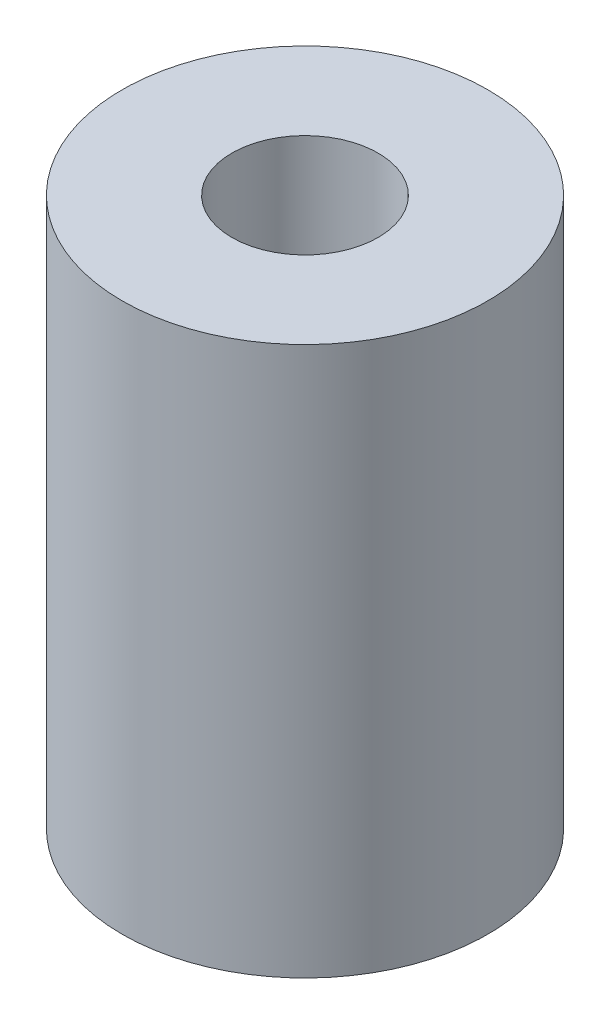
ISO-10303-21;
HEADER;
FILE_DESCRIPTION(('STEP AP214'),'2;1');
FILE_NAME('part.step','',(''),(''),'','','');
FILE_SCHEMA(('AUTOMOTIVE_DESIGN { 1 0 10303 214 1 1 1 1 }'));
ENDSEC;
DATA;
#1=APPLICATION_CONTEXT('core data for automotive mechanical design processes');
#2=APPLICATION_PROTOCOL_DEFINITION('international standard','automotive_design',2000,#1);
#3=PRODUCT_CONTEXT('',#1,'mechanical');
#4=PRODUCT('Part','Part','',(#3));
#5=PRODUCT_RELATED_PRODUCT_CATEGORY('part','',(#4));
#6=PRODUCT_DEFINITION_FORMATION('','',#4);
#7=PRODUCT_DEFINITION_CONTEXT('part definition',#1,'design');
#8=PRODUCT_DEFINITION('design','',#6,#7);
#9=PRODUCT_DEFINITION_SHAPE('','',#8);
#10=(LENGTH_UNIT() NAMED_UNIT(*) SI_UNIT(.MILLI.,.METRE.));
#11=(NAMED_UNIT(*) PLANE_ANGLE_UNIT() SI_UNIT($,.RADIAN.));
#12=(NAMED_UNIT(*) SI_UNIT($,.STERADIAN.) SOLID_ANGLE_UNIT());
#13=UNCERTAINTY_MEASURE_WITH_UNIT(LENGTH_MEASURE(1.E-05),#10,'distance_accuracy_value','');
#14=(GEOMETRIC_REPRESENTATION_CONTEXT(3) GLOBAL_UNCERTAINTY_ASSIGNED_CONTEXT((#13)) GLOBAL_UNIT_ASSIGNED_CONTEXT((#10,
#11,#12)) REPRESENTATION_CONTEXT('',''));
#15=CARTESIAN_POINT('',(0.,0.,0.));
#16=DIRECTION('',(0.,0.,1.));
#17=DIRECTION('',(1.,0.,0.));
#18=AXIS2_PLACEMENT_3D('',#15,#16,#17);
#19=CARTESIAN_POINT('',(0.,23.8125,0.));
#20=DIRECTION('',(0.,1.,0.));
#21=DIRECTION('',(0.,0.,1.));
#22=AXIS2_PLACEMENT_3D('',#19,#20,#21);
#23=PLANE('',#22);
#24=CARTESIAN_POINT('',(0.,23.8125,0.));
#25=DIRECTION('',(0.,1.,0.));
#26=DIRECTION('',(0.,0.,1.));
#27=AXIS2_PLACEMENT_3D('',#24,#25,#26);
#28=CIRCLE('',#27,7.9375);
#29=CARTESIAN_POINT('',(0.,23.8125,7.9375));
#30=VERTEX_POINT('',#29);
#31=EDGE_CURVE('E10',#30,#30,#28,.T.);
#32=ORIENTED_EDGE('',*,*,#31,.T.);
#33=EDGE_LOOP('',(#32));
#34=FACE_BOUND('',#33,.T.);
#35=CARTESIAN_POINT('',(0.,23.8125,0.));
#36=DIRECTION('',(0.,1.,0.));
#37=DIRECTION('',(0.,0.,1.));
#38=AXIS2_PLACEMENT_3D('',#35,#36,#37);
#39=CIRCLE('',#38,3.175);
#40=CARTESIAN_POINT('',(0.,23.8125,3.175));
#41=VERTEX_POINT('',#40);
#42=EDGE_CURVE('E48',#41,#41,#39,.T.);
#43=ORIENTED_EDGE('',*,*,#42,.F.);
#44=EDGE_LOOP('',(#43));
#45=FACE_BOUND('',#44,.T.);
#46=ADVANCED_FACE('F37',(#34,#45),#23,.T.);
#47=CARTESIAN_POINT('',(0.,0.,0.));
#48=DIRECTION('',(0.,1.,0.));
#49=DIRECTION('',(0.,0.,1.));
#50=AXIS2_PLACEMENT_3D('',#47,#48,#49);
#51=PLANE('',#50);
#52=CARTESIAN_POINT('',(0.,0.,0.));
#53=DIRECTION('',(0.,1.,0.));
#54=DIRECTION('',(0.,0.,1.));
#55=AXIS2_PLACEMENT_3D('',#52,#53,#54);
#56=CIRCLE('',#55,7.9375);
#57=CARTESIAN_POINT('',(0.,0.,7.9375));
#58=VERTEX_POINT('',#57);
#59=EDGE_CURVE('E41',#58,#58,#56,.T.);
#60=ORIENTED_EDGE('',*,*,#59,.F.);
#61=EDGE_LOOP('',(#60));
#62=FACE_BOUND('',#61,.T.);
#63=CARTESIAN_POINT('',(0.,0.,0.));
#64=DIRECTION('',(0.,1.,0.));
#65=DIRECTION('',(0.,0.,1.));
#66=AXIS2_PLACEMENT_3D('',#63,#64,#65);
#67=CIRCLE('',#66,3.175);
#68=CARTESIAN_POINT('',(0.,0.,3.175));
#69=VERTEX_POINT('',#68);
#70=EDGE_CURVE('E50',#69,#69,#67,.T.);
#71=ORIENTED_EDGE('',*,*,#70,.T.);
#72=EDGE_LOOP('',(#71));
#73=FACE_BOUND('',#72,.T.);
#74=ADVANCED_FACE('F60',(#62,#73),#51,.F.);
#75=CARTESIAN_POINT('',(0.,23.8125,0.));
#76=DIRECTION('',(0.,-1.,0.));
#77=DIRECTION('',(0.,0.,-1.));
#78=AXIS2_PLACEMENT_3D('',#75,#76,#77);
#79=CYLINDRICAL_SURFACE('',#78,7.9375);
#80=ORIENTED_EDGE('',*,*,#31,.F.);
#81=EDGE_LOOP('',(#80));
#82=FACE_BOUND('',#81,.T.);
#83=ORIENTED_EDGE('',*,*,#59,.T.);
#84=EDGE_LOOP('',(#83));
#85=FACE_BOUND('',#84,.T.);
#86=ADVANCED_FACE('F39',(#82,#85),#79,.T.);
#87=CARTESIAN_POINT('',(0.,23.8125,0.));
#88=DIRECTION('',(0.,-1.,0.));
#89=DIRECTION('',(0.,0.,-1.));
#90=AXIS2_PLACEMENT_3D('',#87,#88,#89);
#91=CYLINDRICAL_SURFACE('',#90,3.175);
#92=ORIENTED_EDGE('',*,*,#42,.T.);
#93=EDGE_LOOP('',(#92));
#94=FACE_BOUND('',#93,.T.);
#95=ORIENTED_EDGE('',*,*,#70,.F.);
#96=EDGE_LOOP('',(#95));
#97=FACE_BOUND('',#96,.T.);
#98=ADVANCED_FACE('F56',(#94,#97),#91,.F.);
#99=CLOSED_SHELL('',(#46,#74,#86,#98));
#100=MANIFOLD_SOLID_BREP('B2',#99);
#101=ADVANCED_BREP_SHAPE_REPRESENTATION('',(#18,#100),#14);
#102=SHAPE_DEFINITION_REPRESENTATION(#9,#101);
ENDSEC;
END-ISO-10303-21;
